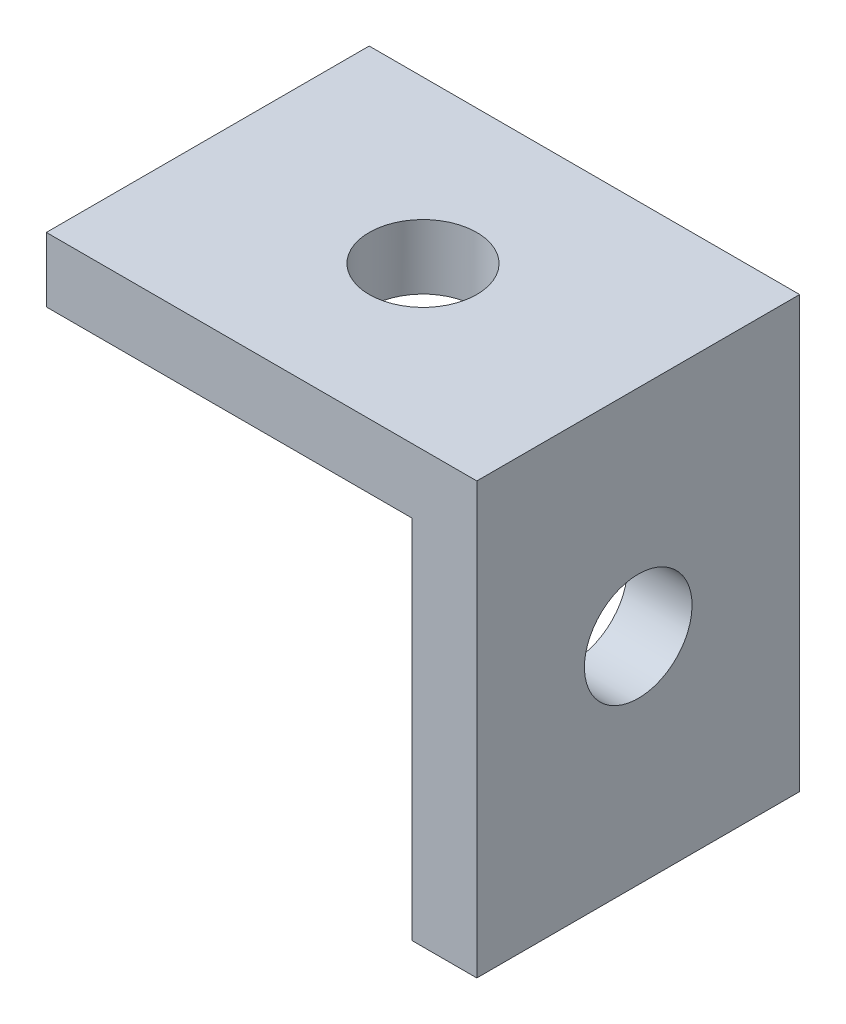
ISO-10303-21;
HEADER;
FILE_DESCRIPTION(('STEP AP214'),'2;1');
FILE_NAME('part.step','',(''),(''),'','','');
FILE_SCHEMA(('AUTOMOTIVE_DESIGN { 1 0 10303 214 1 1 1 1 }'));
ENDSEC;
DATA;
#1=APPLICATION_CONTEXT('core data for automotive mechanical design processes');
#2=APPLICATION_PROTOCOL_DEFINITION('international standard','automotive_design',2000,#1);
#3=PRODUCT_CONTEXT('',#1,'mechanical');
#4=PRODUCT('Part','Part','',(#3));
#5=PRODUCT_RELATED_PRODUCT_CATEGORY('part','',(#4));
#6=PRODUCT_DEFINITION_FORMATION('','',#4);
#7=PRODUCT_DEFINITION_CONTEXT('part definition',#1,'design');
#8=PRODUCT_DEFINITION('design','',#6,#7);
#9=PRODUCT_DEFINITION_SHAPE('','',#8);
#10=(LENGTH_UNIT() NAMED_UNIT(*) SI_UNIT(.MILLI.,.METRE.));
#11=(NAMED_UNIT(*) PLANE_ANGLE_UNIT() SI_UNIT($,.RADIAN.));
#12=(NAMED_UNIT(*) SI_UNIT($,.STERADIAN.) SOLID_ANGLE_UNIT());
#13=UNCERTAINTY_MEASURE_WITH_UNIT(LENGTH_MEASURE(1.E-05),#10,'distance_accuracy_value','');
#14=(GEOMETRIC_REPRESENTATION_CONTEXT(3) GLOBAL_UNCERTAINTY_ASSIGNED_CONTEXT((#13)) GLOBAL_UNIT_ASSIGNED_CONTEXT((#10,
#11,#12)) REPRESENTATION_CONTEXT('',''));
#15=CARTESIAN_POINT('',(0.,0.,0.));
#16=DIRECTION('',(0.,0.,1.));
#17=DIRECTION('',(1.,0.,0.));
#18=AXIS2_PLACEMENT_3D('',#15,#16,#17);
#19=CARTESIAN_POINT('',(20.,-3.,15.));
#20=DIRECTION('',(0.,1.,0.));
#21=DIRECTION('',(-1.,0.,0.));
#22=AXIS2_PLACEMENT_3D('',#19,#20,#21);
#23=PLANE('',#22);
#24=CARTESIAN_POINT('',(13.,-3.,7.5));
#25=DIRECTION('',(0.,1.,0.));
#26=DIRECTION('',(-1.,0.,0.));
#27=AXIS2_PLACEMENT_3D('',#24,#25,#26);
#28=CIRCLE('',#27,2.5);
#29=CARTESIAN_POINT('',(10.5,-3.,7.5));
#30=VERTEX_POINT('',#29);
#31=EDGE_CURVE('E118',#30,#30,#28,.T.);
#32=ORIENTED_EDGE('',*,*,#31,.T.);
#33=EDGE_LOOP('',(#32));
#34=FACE_BOUND('',#33,.T.);
#35=DIRECTION('',(1.,0.,0.));
#36=VECTOR('',#35,1.);
#37=CARTESIAN_POINT('',(20.,-3.,15.));
#38=LINE('',#37,#36);
#39=CARTESIAN_POINT('',(3.,-3.,15.));
#40=VERTEX_POINT('',#39);
#41=CARTESIAN_POINT('',(20.,-3.,15.));
#42=VERTEX_POINT('',#41);
#43=EDGE_CURVE('E123',#40,#42,#38,.T.);
#44=ORIENTED_EDGE('',*,*,#43,.F.);
#45=DIRECTION('',(0.,0.,-1.));
#46=VECTOR('',#45,1.);
#47=CARTESIAN_POINT('',(3.,-3.,15.));
#48=LINE('',#47,#46);
#49=CARTESIAN_POINT('',(3.,-3.,0.));
#50=VERTEX_POINT('',#49);
#51=EDGE_CURVE('E87',#40,#50,#48,.T.);
#52=ORIENTED_EDGE('',*,*,#51,.T.);
#53=DIRECTION('',(1.,0.,0.));
#54=VECTOR('',#53,1.);
#55=CARTESIAN_POINT('',(20.,-3.,0.));
#56=LINE('',#55,#54);
#57=CARTESIAN_POINT('',(20.,-3.,0.));
#58=VERTEX_POINT('',#57);
#59=EDGE_CURVE('E115',#50,#58,#56,.T.);
#60=ORIENTED_EDGE('',*,*,#59,.T.);
#61=DIRECTION('',(0.,0.,-1.));
#62=VECTOR('',#61,1.);
#63=CARTESIAN_POINT('',(20.,-3.,15.));
#64=LINE('',#63,#62);
#65=EDGE_CURVE('E109',#42,#58,#64,.T.);
#66=ORIENTED_EDGE('',*,*,#65,.F.);
#67=EDGE_LOOP('',(#44,#52,#60,#66));
#68=FACE_BOUND('',#67,.T.);
#69=ADVANCED_FACE('F35',(#34,#68),#23,.F.);
#70=CARTESIAN_POINT('',(20.,-23.,15.));
#71=DIRECTION('',(1.,0.,0.));
#72=DIRECTION('',(0.,1.,0.));
#73=AXIS2_PLACEMENT_3D('',#70,#71,#72);
#74=PLANE('',#73);
#75=CARTESIAN_POINT('',(20.,-10.,7.5));
#76=DIRECTION('',(1.,0.,0.));
#77=DIRECTION('',(0.,1.,0.));
#78=AXIS2_PLACEMENT_3D('',#75,#76,#77);
#79=CIRCLE('',#78,2.5);
#80=CARTESIAN_POINT('',(20.,-7.5,7.5));
#81=VERTEX_POINT('',#80);
#82=EDGE_CURVE('E146',#81,#81,#79,.T.);
#83=ORIENTED_EDGE('',*,*,#82,.T.);
#84=EDGE_LOOP('',(#83));
#85=FACE_BOUND('',#84,.T.);
#86=DIRECTION('',(0.,-1.,0.));
#87=VECTOR('',#86,1.);
#88=CARTESIAN_POINT('',(20.,-23.,0.));
#89=LINE('',#88,#87);
#90=CARTESIAN_POINT('',(20.,-20.,0.));
#91=VERTEX_POINT('',#90);
#92=EDGE_CURVE('E117',#58,#91,#89,.T.);
#93=ORIENTED_EDGE('',*,*,#92,.T.);
#94=DIRECTION('',(0.,0.,1.));
#95=VECTOR('',#94,1.);
#96=CARTESIAN_POINT('',(20.,-20.,15.));
#97=LINE('',#96,#95);
#98=CARTESIAN_POINT('',(20.,-20.,15.));
#99=VERTEX_POINT('',#98);
#100=EDGE_CURVE('E56',#91,#99,#97,.T.);
#101=ORIENTED_EDGE('',*,*,#100,.T.);
#102=DIRECTION('',(0.,-1.,0.));
#103=VECTOR('',#102,1.);
#104=CARTESIAN_POINT('',(20.,-23.,15.));
#105=LINE('',#104,#103);
#106=EDGE_CURVE('E111',#42,#99,#105,.T.);
#107=ORIENTED_EDGE('',*,*,#106,.F.);
#108=ORIENTED_EDGE('',*,*,#65,.T.);
#109=EDGE_LOOP('',(#93,#101,#107,#108));
#110=FACE_BOUND('',#109,.T.);
#111=ADVANCED_FACE('F157',(#85,#110),#74,.F.);
#112=CARTESIAN_POINT('',(23.,0.,15.));
#113=DIRECTION('',(-1.,0.,0.));
#114=DIRECTION('',(0.,-1.,0.));
#115=AXIS2_PLACEMENT_3D('',#112,#113,#114);
#116=PLANE('',#115);
#117=CARTESIAN_POINT('',(23.,-10.,7.5));
#118=DIRECTION('',(1.,0.,0.));
#119=DIRECTION('',(0.,1.,0.));
#120=AXIS2_PLACEMENT_3D('',#117,#118,#119);
#121=CIRCLE('',#120,2.5);
#122=CARTESIAN_POINT('',(23.,-7.5,7.5));
#123=VERTEX_POINT('',#122);
#124=EDGE_CURVE('E143',#123,#123,#121,.T.);
#125=ORIENTED_EDGE('',*,*,#124,.F.);
#126=EDGE_LOOP('',(#125));
#127=FACE_BOUND('',#126,.T.);
#128=DIRECTION('',(0.,1.,0.));
#129=VECTOR('',#128,1.);
#130=CARTESIAN_POINT('',(23.,0.,15.));
#131=LINE('',#130,#129);
#132=CARTESIAN_POINT('',(23.,-20.,15.));
#133=VERTEX_POINT('',#132);
#134=CARTESIAN_POINT('',(23.,0.,15.));
#135=VERTEX_POINT('',#134);
#136=EDGE_CURVE('E105',#133,#135,#131,.T.);
#137=ORIENTED_EDGE('',*,*,#136,.F.);
#138=DIRECTION('',(0.,0.,1.));
#139=VECTOR('',#138,1.);
#140=CARTESIAN_POINT('',(23.,-20.,19.1340360827966));
#141=LINE('',#140,#139);
#142=CARTESIAN_POINT('',(23.,-20.,0.));
#143=VERTEX_POINT('',#142);
#144=EDGE_CURVE('E91',#143,#133,#141,.T.);
#145=ORIENTED_EDGE('',*,*,#144,.F.);
#146=DIRECTION('',(0.,1.,0.));
#147=VECTOR('',#146,1.);
#148=CARTESIAN_POINT('',(23.,0.,0.));
#149=LINE('',#148,#147);
#150=CARTESIAN_POINT('',(23.,0.,0.));
#151=VERTEX_POINT('',#150);
#152=EDGE_CURVE('E121',#143,#151,#149,.T.);
#153=ORIENTED_EDGE('',*,*,#152,.T.);
#154=DIRECTION('',(0.,0.,-1.));
#155=VECTOR('',#154,1.);
#156=CARTESIAN_POINT('',(23.,0.,15.));
#157=LINE('',#156,#155);
#158=EDGE_CURVE('E107',#135,#151,#157,.T.);
#159=ORIENTED_EDGE('',*,*,#158,.F.);
#160=EDGE_LOOP('',(#137,#145,#153,#159));
#161=FACE_BOUND('',#160,.T.);
#162=ADVANCED_FACE('F132',(#127,#161),#116,.F.);
#163=CARTESIAN_POINT('',(0.,0.,15.));
#164=DIRECTION('',(0.,-1.,0.));
#165=DIRECTION('',(0.,0.,-1.));
#166=AXIS2_PLACEMENT_3D('',#163,#164,#165);
#167=PLANE('',#166);
#168=CARTESIAN_POINT('',(13.,0.,7.5));
#169=DIRECTION('',(0.,1.,0.));
#170=DIRECTION('',(0.,0.,1.));
#171=AXIS2_PLACEMENT_3D('',#168,#169,#170);
#172=CIRCLE('',#171,2.5);
#173=CARTESIAN_POINT('',(13.,0.,10.));
#174=VERTEX_POINT('',#173);
#175=EDGE_CURVE('E149',#174,#174,#172,.T.);
#176=ORIENTED_EDGE('',*,*,#175,.F.);
#177=EDGE_LOOP('',(#176));
#178=FACE_BOUND('',#177,.T.);
#179=DIRECTION('',(-1.,0.,0.));
#180=VECTOR('',#179,1.);
#181=CARTESIAN_POINT('',(0.,0.,0.));
#182=LINE('',#181,#180);
#183=CARTESIAN_POINT('',(3.,0.,0.));
#184=VERTEX_POINT('',#183);
#185=EDGE_CURVE('E100',#151,#184,#182,.T.);
#186=ORIENTED_EDGE('',*,*,#185,.T.);
#187=DIRECTION('',(0.,0.,-1.));
#188=VECTOR('',#187,1.);
#189=CARTESIAN_POINT('',(3.,0.,-1.36282989504474));
#190=LINE('',#189,#188);
#191=CARTESIAN_POINT('',(3.,0.,15.));
#192=VERTEX_POINT('',#191);
#193=EDGE_CURVE('E48',#192,#184,#190,.T.);
#194=ORIENTED_EDGE('',*,*,#193,.F.);
#195=DIRECTION('',(-1.,0.,0.));
#196=VECTOR('',#195,1.);
#197=CARTESIAN_POINT('',(0.,0.,15.));
#198=LINE('',#197,#196);
#199=EDGE_CURVE('E98',#135,#192,#198,.T.);
#200=ORIENTED_EDGE('',*,*,#199,.F.);
#201=ORIENTED_EDGE('',*,*,#158,.T.);
#202=EDGE_LOOP('',(#186,#194,#200,#201));
#203=FACE_BOUND('',#202,.T.);
#204=ADVANCED_FACE('F96',(#178,#203),#167,.F.);
#205=CARTESIAN_POINT('',(0.,0.,15.));
#206=DIRECTION('',(0.,0.,-1.));
#207=DIRECTION('',(-1.,0.,0.));
#208=AXIS2_PLACEMENT_3D('',#205,#206,#207);
#209=PLANE('',#208);
#210=ORIENTED_EDGE('',*,*,#199,.T.);
#211=DIRECTION('',(0.,-1.,0.));
#212=VECTOR('',#211,1.);
#213=CARTESIAN_POINT('',(3.,0.,15.));
#214=LINE('',#213,#212);
#215=EDGE_CURVE('E84',#192,#40,#214,.T.);
#216=ORIENTED_EDGE('',*,*,#215,.T.);
#217=ORIENTED_EDGE('',*,*,#43,.T.);
#218=ORIENTED_EDGE('',*,*,#106,.T.);
#219=DIRECTION('',(1.,0.,0.));
#220=VECTOR('',#219,1.);
#221=CARTESIAN_POINT('',(0.,-20.,15.));
#222=LINE('',#221,#220);
#223=EDGE_CURVE('E141',#99,#133,#222,.T.);
#224=ORIENTED_EDGE('',*,*,#223,.T.);
#225=ORIENTED_EDGE('',*,*,#136,.T.);
#226=EDGE_LOOP('',(#210,#216,#217,#218,#224,#225));
#227=FACE_BOUND('',#226,.T.);
#228=ADVANCED_FACE('F102',(#227),#209,.F.);
#229=CARTESIAN_POINT('',(0.,0.,0.));
#230=DIRECTION('',(0.,0.,-1.));
#231=DIRECTION('',(-1.,0.,0.));
#232=AXIS2_PLACEMENT_3D('',#229,#230,#231);
#233=PLANE('',#232);
#234=DIRECTION('',(0.,-1.,0.));
#235=VECTOR('',#234,1.);
#236=CARTESIAN_POINT('',(3.,0.,0.));
#237=LINE('',#236,#235);
#238=EDGE_CURVE('E11',#184,#50,#237,.T.);
#239=ORIENTED_EDGE('',*,*,#238,.F.);
#240=ORIENTED_EDGE('',*,*,#185,.F.);
#241=ORIENTED_EDGE('',*,*,#152,.F.);
#242=DIRECTION('',(1.,0.,0.));
#243=VECTOR('',#242,1.);
#244=CARTESIAN_POINT('',(0.,-20.,0.));
#245=LINE('',#244,#243);
#246=EDGE_CURVE('E42',#91,#143,#245,.T.);
#247=ORIENTED_EDGE('',*,*,#246,.F.);
#248=ORIENTED_EDGE('',*,*,#92,.F.);
#249=ORIENTED_EDGE('',*,*,#59,.F.);
#250=EDGE_LOOP('',(#239,#240,#241,#247,#248,#249));
#251=FACE_BOUND('',#250,.T.);
#252=ADVANCED_FACE('F134',(#251),#233,.T.);
#253=CARTESIAN_POINT('',(13.,-15.,7.5));
#254=DIRECTION('',(0.,1.,0.));
#255=DIRECTION('',(0.,0.,1.));
#256=AXIS2_PLACEMENT_3D('',#253,#254,#255);
#257=CYLINDRICAL_SURFACE('',#256,2.5);
#258=ORIENTED_EDGE('',*,*,#175,.T.);
#259=EDGE_LOOP('',(#258));
#260=FACE_BOUND('',#259,.T.);
#261=ORIENTED_EDGE('',*,*,#31,.F.);
#262=EDGE_LOOP('',(#261));
#263=FACE_BOUND('',#262,.T.);
#264=ADVANCED_FACE('F173',(#260,#263),#257,.F.);
#265=CARTESIAN_POINT('',(8.,-10.,7.5));
#266=DIRECTION('',(1.,0.,0.));
#267=DIRECTION('',(0.,1.,0.));
#268=AXIS2_PLACEMENT_3D('',#265,#266,#267);
#269=CYLINDRICAL_SURFACE('',#268,2.5);
#270=ORIENTED_EDGE('',*,*,#124,.T.);
#271=EDGE_LOOP('',(#270));
#272=FACE_BOUND('',#271,.T.);
#273=ORIENTED_EDGE('',*,*,#82,.F.);
#274=EDGE_LOOP('',(#273));
#275=FACE_BOUND('',#274,.T.);
#276=ADVANCED_FACE('F178',(#272,#275),#269,.F.);
#277=CARTESIAN_POINT('',(8.,-20.,19.1340360827966));
#278=DIRECTION('',(0.,1.,0.));
#279=DIRECTION('',(-1.,0.,0.));
#280=AXIS2_PLACEMENT_3D('',#277,#278,#279);
#281=PLANE('',#280);
#282=ORIENTED_EDGE('',*,*,#100,.F.);
#283=ORIENTED_EDGE('',*,*,#246,.T.);
#284=ORIENTED_EDGE('',*,*,#144,.T.);
#285=ORIENTED_EDGE('',*,*,#223,.F.);
#286=EDGE_LOOP('',(#282,#283,#284,#285));
#287=FACE_BOUND('',#286,.T.);
#288=ADVANCED_FACE('F127',(#287),#281,.F.);
#289=CARTESIAN_POINT('',(3.,-15.,-1.36282989504474));
#290=DIRECTION('',(1.,0.,0.));
#291=DIRECTION('',(0.,0.,-1.));
#292=AXIS2_PLACEMENT_3D('',#289,#290,#291);
#293=PLANE('',#292);
#294=ORIENTED_EDGE('',*,*,#193,.T.);
#295=ORIENTED_EDGE('',*,*,#238,.T.);
#296=ORIENTED_EDGE('',*,*,#51,.F.);
#297=ORIENTED_EDGE('',*,*,#215,.F.);
#298=EDGE_LOOP('',(#294,#295,#296,#297));
#299=FACE_BOUND('',#298,.T.);
#300=ADVANCED_FACE('F85',(#299),#293,.F.);
#301=CLOSED_SHELL('',(#69,#111,#162,#204,#228,#252,#264,#276,#288,#300));
#302=MANIFOLD_SOLID_BREP('B2',#301);
#303=ADVANCED_BREP_SHAPE_REPRESENTATION('',(#18,#302),#14);
#304=SHAPE_DEFINITION_REPRESENTATION(#9,#303);
ENDSEC;
END-ISO-10303-21;
